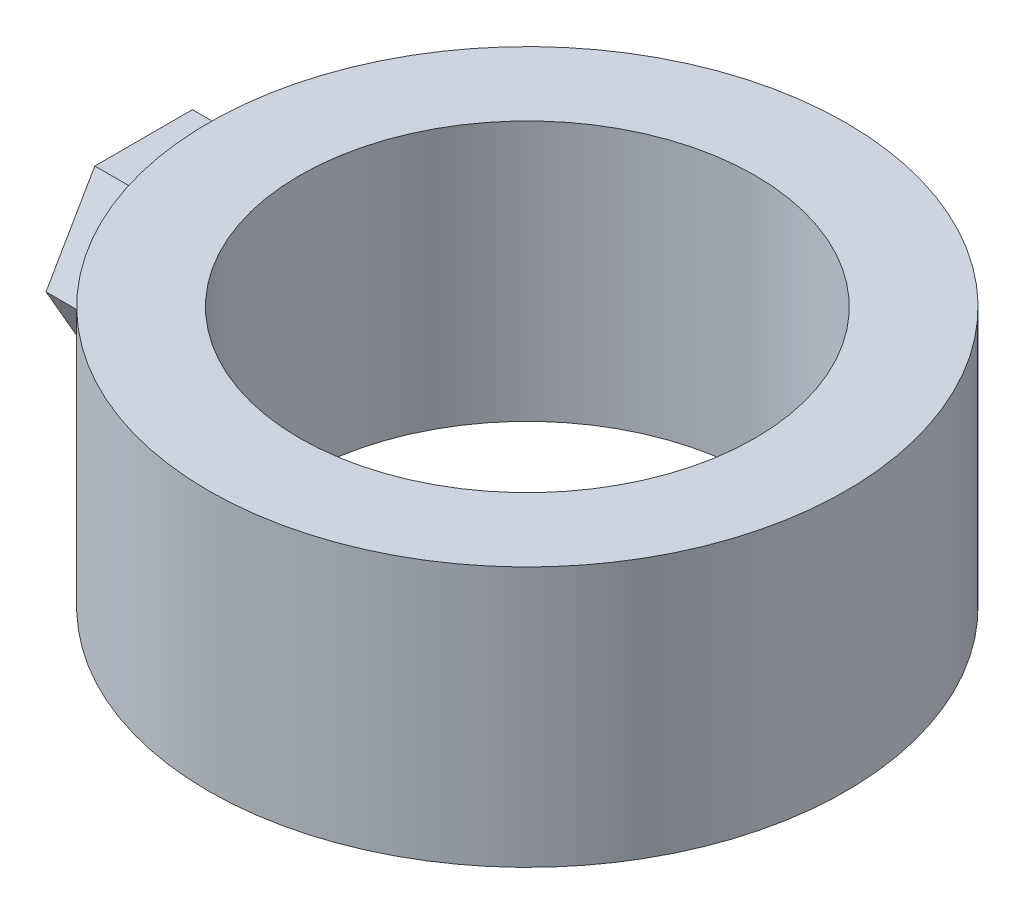
ISO-10303-21;
HEADER;
FILE_DESCRIPTION(('STEP AP214'),'2;1');
FILE_NAME('part.step','',(''),(''),'','','');
FILE_SCHEMA(('AUTOMOTIVE_DESIGN { 1 0 10303 214 1 1 1 1 }'));
ENDSEC;
DATA;
#1=APPLICATION_CONTEXT('core data for automotive mechanical design processes');
#2=APPLICATION_PROTOCOL_DEFINITION('international standard','automotive_design',2000,#1);
#3=PRODUCT_CONTEXT('',#1,'mechanical');
#4=PRODUCT('Part','Part','',(#3));
#5=PRODUCT_RELATED_PRODUCT_CATEGORY('part','',(#4));
#6=PRODUCT_DEFINITION_FORMATION('','',#4);
#7=PRODUCT_DEFINITION_CONTEXT('part definition',#1,'design');
#8=PRODUCT_DEFINITION('design','',#6,#7);
#9=PRODUCT_DEFINITION_SHAPE('','',#8);
#10=(LENGTH_UNIT() NAMED_UNIT(*) SI_UNIT(.MILLI.,.METRE.));
#11=(NAMED_UNIT(*) PLANE_ANGLE_UNIT() SI_UNIT($,.RADIAN.));
#12=(NAMED_UNIT(*) SI_UNIT($,.STERADIAN.) SOLID_ANGLE_UNIT());
#13=UNCERTAINTY_MEASURE_WITH_UNIT(LENGTH_MEASURE(1.E-05),#10,'distance_accuracy_value','');
#14=(GEOMETRIC_REPRESENTATION_CONTEXT(3) GLOBAL_UNCERTAINTY_ASSIGNED_CONTEXT((#13)) GLOBAL_UNIT_ASSIGNED_CONTEXT((#10,
#11,#12)) REPRESENTATION_CONTEXT('',''));
#15=CARTESIAN_POINT('',(0.,0.,0.));
#16=DIRECTION('',(0.,0.,1.));
#17=DIRECTION('',(1.,0.,0.));
#18=AXIS2_PLACEMENT_3D('',#15,#16,#17);
#19=CARTESIAN_POINT('',(0.,10.,0.));
#20=DIRECTION('',(0.,1.,0.));
#21=DIRECTION('',(0.,0.,1.));
#22=AXIS2_PLACEMENT_3D('',#19,#20,#21);
#23=PLANE('',#22);
#24=CARTESIAN_POINT('',(0.,10.,0.));
#25=DIRECTION('',(0.,1.,0.));
#26=DIRECTION('',(0.,0.,1.));
#27=AXIS2_PLACEMENT_3D('',#24,#25,#26);
#28=CIRCLE('',#27,24.5);
#29=CARTESIAN_POINT('',(0.,10.,24.5));
#30=VERTEX_POINT('',#29);
#31=EDGE_CURVE('E151',#30,#30,#28,.T.);
#32=ORIENTED_EDGE('',*,*,#31,.T.);
#33=EDGE_LOOP('',(#32));
#34=FACE_BOUND('',#33,.T.);
#35=CARTESIAN_POINT('',(0.,10.,0.));
#36=DIRECTION('',(0.,1.,0.));
#37=DIRECTION('',(0.,0.,1.));
#38=AXIS2_PLACEMENT_3D('',#35,#36,#37);
#39=CIRCLE('',#38,17.5);
#40=CARTESIAN_POINT('',(0.,10.,17.5));
#41=VERTEX_POINT('',#40);
#42=EDGE_CURVE('E145',#41,#41,#39,.T.);
#43=ORIENTED_EDGE('',*,*,#42,.F.);
#44=EDGE_LOOP('',(#43));
#45=FACE_BOUND('',#44,.T.);
#46=ADVANCED_FACE('F47',(#34,#45),#23,.T.);
#47=CARTESIAN_POINT('',(0.,-10.,0.));
#48=DIRECTION('',(0.,1.,0.));
#49=DIRECTION('',(0.,0.,1.));
#50=AXIS2_PLACEMENT_3D('',#47,#48,#49);
#51=PLANE('',#50);
#52=CARTESIAN_POINT('',(0.,-10.,0.));
#53=DIRECTION('',(0.,1.,0.));
#54=DIRECTION('',(0.,0.,1.));
#55=AXIS2_PLACEMENT_3D('',#52,#53,#54);
#56=CIRCLE('',#55,24.5);
#57=CARTESIAN_POINT('',(0.,-10.,24.5));
#58=VERTEX_POINT('',#57);
#59=EDGE_CURVE('E148',#58,#58,#56,.T.);
#60=ORIENTED_EDGE('',*,*,#59,.F.);
#61=EDGE_LOOP('',(#60));
#62=FACE_BOUND('',#61,.T.);
#63=CARTESIAN_POINT('',(0.,-10.,0.));
#64=DIRECTION('',(0.,1.,0.));
#65=DIRECTION('',(0.,0.,1.));
#66=AXIS2_PLACEMENT_3D('',#63,#64,#65);
#67=CIRCLE('',#66,17.5);
#68=CARTESIAN_POINT('',(0.,-10.,17.5));
#69=VERTEX_POINT('',#68);
#70=EDGE_CURVE('E134',#69,#69,#67,.T.);
#71=ORIENTED_EDGE('',*,*,#70,.T.);
#72=EDGE_LOOP('',(#71));
#73=FACE_BOUND('',#72,.T.);
#74=ADVANCED_FACE('F186',(#62,#73),#51,.F.);
#75=CARTESIAN_POINT('',(0.,10.,0.));
#76=DIRECTION('',(0.,-1.,0.));
#77=DIRECTION('',(0.,0.,-1.));
#78=AXIS2_PLACEMENT_3D('',#75,#76,#77);
#79=CYLINDRICAL_SURFACE('',#78,24.5);
#80=CARTESIAN_POINT('',(0.,-6.5,0.));
#81=DIRECTION('',(0.,-1.,0.));
#82=DIRECTION('',(0.,0.,-1.));
#83=AXIS2_PLACEMENT_3D('',#80,#81,#82);
#84=CIRCLE('',#83,24.5);
#85=CARTESIAN_POINT('',(-24.2108790973535,-6.5,3.75277674973257));
#86=VERTEX_POINT('',#85);
#87=CARTESIAN_POINT('',(-24.2108790973535,-6.5,-3.75277674973257));
#88=VERTEX_POINT('',#87);
#89=EDGE_CURVE('E55',#86,#88,#84,.T.);
#90=ORIENTED_EDGE('',*,*,#89,.T.);
#91=CARTESIAN_POINT('',(0.,-13.,0.));
#92=DIRECTION('',(0.,-0.5,-0.866025403784439));
#93=DIRECTION('',(0.,-0.866025403784439,0.5));
#94=AXIS2_PLACEMENT_3D('',#91,#92,#93);
#95=ELLIPSE('',#94,49.,24.5);
#96=CARTESIAN_POINT('',(-23.3220210673661,0.,-7.50555349946513));
#97=VERTEX_POINT('',#96);
#98=EDGE_CURVE('E13',#88,#97,#95,.T.);
#99=ORIENTED_EDGE('',*,*,#98,.T.);
#100=CARTESIAN_POINT('',(0.,13.,0.));
#101=DIRECTION('',(0.,0.5,-0.866025403784438));
#102=DIRECTION('',(0.,-0.866025403784439,-0.5));
#103=AXIS2_PLACEMENT_3D('',#100,#101,#102);
#104=ELLIPSE('',#103,49.,24.5);
#105=CARTESIAN_POINT('',(-24.2108790973535,6.5,-3.75277674973257));
#106=VERTEX_POINT('',#105);
#107=EDGE_CURVE('E101',#97,#106,#104,.T.);
#108=ORIENTED_EDGE('',*,*,#107,.T.);
#109=CARTESIAN_POINT('',(0.,6.5,0.));
#110=DIRECTION('',(0.,1.,0.));
#111=DIRECTION('',(0.,0.,1.));
#112=AXIS2_PLACEMENT_3D('',#109,#110,#111);
#113=CIRCLE('',#112,24.5);
#114=CARTESIAN_POINT('',(-24.2108790973535,6.5,3.75277674973257));
#115=VERTEX_POINT('',#114);
#116=EDGE_CURVE('E157',#106,#115,#113,.T.);
#117=ORIENTED_EDGE('',*,*,#116,.T.);
#118=CARTESIAN_POINT('',(0.,13.,0.));
#119=DIRECTION('',(0.,0.5,0.866025403784439));
#120=DIRECTION('',(0.,-0.866025403784439,0.5));
#121=AXIS2_PLACEMENT_3D('',#118,#119,#120);
#122=ELLIPSE('',#121,49.,24.5);
#123=CARTESIAN_POINT('',(-23.3220210673661,0.,7.50555349946513));
#124=VERTEX_POINT('',#123);
#125=EDGE_CURVE('E160',#115,#124,#122,.T.);
#126=ORIENTED_EDGE('',*,*,#125,.T.);
#127=CARTESIAN_POINT('',(0.,-13.,0.));
#128=DIRECTION('',(0.,-0.5,0.866025403784439));
#129=DIRECTION('',(0.,-0.866025403784439,-0.5));
#130=AXIS2_PLACEMENT_3D('',#127,#128,#129);
#131=ELLIPSE('',#130,49.,24.5);
#132=EDGE_CURVE('E163',#124,#86,#131,.T.);
#133=ORIENTED_EDGE('',*,*,#132,.T.);
#134=EDGE_LOOP('',(#90,#99,#108,#117,#126,#133));
#135=FACE_BOUND('',#134,.T.);
#136=ORIENTED_EDGE('',*,*,#31,.F.);
#137=EDGE_LOOP('',(#136));
#138=FACE_BOUND('',#137,.T.);
#139=ORIENTED_EDGE('',*,*,#59,.T.);
#140=EDGE_LOOP('',(#139));
#141=FACE_BOUND('',#140,.T.);
#142=ADVANCED_FACE('F49',(#135,#138,#141),#79,.T.);
#143=CARTESIAN_POINT('',(0.,10.,0.));
#144=DIRECTION('',(0.,-1.,0.));
#145=DIRECTION('',(0.,0.,-1.));
#146=AXIS2_PLACEMENT_3D('',#143,#144,#145);
#147=CYLINDRICAL_SURFACE('',#146,17.5);
#148=ORIENTED_EDGE('',*,*,#42,.T.);
#149=EDGE_LOOP('',(#148));
#150=FACE_BOUND('',#149,.T.);
#151=ORIENTED_EDGE('',*,*,#70,.F.);
#152=EDGE_LOOP('',(#151));
#153=FACE_BOUND('',#152,.T.);
#154=ADVANCED_FACE('F195',(#150,#153),#147,.F.);
#155=CARTESIAN_POINT('',(-29.5,-6.5,-3.75277674973257));
#156=DIRECTION('',(0.,-0.5,-0.866025403784439));
#157=DIRECTION('',(0.,0.866025403784439,-0.5));
#158=AXIS2_PLACEMENT_3D('',#155,#156,#157);
#159=PLANE('',#158);
#160=ORIENTED_EDGE('',*,*,#98,.F.);
#161=DIRECTION('',(1.,0.,0.));
#162=VECTOR('',#161,1.);
#163=CARTESIAN_POINT('',(-29.5,-6.5,-3.75277674973257));
#164=LINE('',#163,#162);
#165=CARTESIAN_POINT('',(-29.5,-6.5,-3.75277674973257));
#166=VERTEX_POINT('',#165);
#167=EDGE_CURVE('E117',#166,#88,#164,.T.);
#168=ORIENTED_EDGE('',*,*,#167,.F.);
#169=DIRECTION('',(0.,0.866025403784439,-0.5));
#170=VECTOR('',#169,1.);
#171=CARTESIAN_POINT('',(-29.5,-6.5,-3.75277674973257));
#172=LINE('',#171,#170);
#173=CARTESIAN_POINT('',(-29.5,0.,-7.50555349946513));
#174=VERTEX_POINT('',#173);
#175=EDGE_CURVE('E110',#166,#174,#172,.T.);
#176=ORIENTED_EDGE('',*,*,#175,.T.);
#177=DIRECTION('',(1.,0.,0.));
#178=VECTOR('',#177,1.);
#179=CARTESIAN_POINT('',(-29.5,0.,-7.50555349946513));
#180=LINE('',#179,#178);
#181=EDGE_CURVE('E96',#174,#97,#180,.T.);
#182=ORIENTED_EDGE('',*,*,#181,.T.);
#183=EDGE_LOOP('',(#160,#168,#176,#182));
#184=FACE_BOUND('',#183,.T.);
#185=ADVANCED_FACE('F116',(#184),#159,.T.);
#186=CARTESIAN_POINT('',(-29.5,-6.5,3.75277674973257));
#187=DIRECTION('',(0.,-1.,0.));
#188=DIRECTION('',(0.,0.,-1.));
#189=AXIS2_PLACEMENT_3D('',#186,#187,#188);
#190=PLANE('',#189);
#191=ORIENTED_EDGE('',*,*,#89,.F.);
#192=DIRECTION('',(1.,0.,0.));
#193=VECTOR('',#192,1.);
#194=CARTESIAN_POINT('',(-29.5,-6.5,3.75277674973257));
#195=LINE('',#194,#193);
#196=CARTESIAN_POINT('',(-29.5,-6.5,3.75277674973257));
#197=VERTEX_POINT('',#196);
#198=EDGE_CURVE('E135',#197,#86,#195,.T.);
#199=ORIENTED_EDGE('',*,*,#198,.F.);
#200=DIRECTION('',(0.,0.,-1.));
#201=VECTOR('',#200,1.);
#202=CARTESIAN_POINT('',(-29.5,-6.5,3.75277674973257));
#203=LINE('',#202,#201);
#204=EDGE_CURVE('E103',#197,#166,#203,.T.);
#205=ORIENTED_EDGE('',*,*,#204,.T.);
#206=ORIENTED_EDGE('',*,*,#167,.T.);
#207=EDGE_LOOP('',(#191,#199,#205,#206));
#208=FACE_BOUND('',#207,.T.);
#209=ADVANCED_FACE('F169',(#208),#190,.T.);
#210=CARTESIAN_POINT('',(-29.5,0.,7.50555349946513));
#211=DIRECTION('',(0.,-0.5,0.866025403784439));
#212=DIRECTION('',(0.,-0.866025403784439,-0.5));
#213=AXIS2_PLACEMENT_3D('',#210,#211,#212);
#214=PLANE('',#213);
#215=ORIENTED_EDGE('',*,*,#132,.F.);
#216=DIRECTION('',(1.,0.,0.));
#217=VECTOR('',#216,1.);
#218=CARTESIAN_POINT('',(-29.5,0.,7.50555349946513));
#219=LINE('',#218,#217);
#220=CARTESIAN_POINT('',(-29.5,0.,7.50555349946513));
#221=VERTEX_POINT('',#220);
#222=EDGE_CURVE('E138',#221,#124,#219,.T.);
#223=ORIENTED_EDGE('',*,*,#222,.F.);
#224=DIRECTION('',(0.,-0.866025403784439,-0.5));
#225=VECTOR('',#224,1.);
#226=CARTESIAN_POINT('',(-29.5,0.,7.50555349946513));
#227=LINE('',#226,#225);
#228=EDGE_CURVE('E129',#221,#197,#227,.T.);
#229=ORIENTED_EDGE('',*,*,#228,.T.);
#230=ORIENTED_EDGE('',*,*,#198,.T.);
#231=EDGE_LOOP('',(#215,#223,#229,#230));
#232=FACE_BOUND('',#231,.T.);
#233=ADVANCED_FACE('F171',(#232),#214,.T.);
#234=CARTESIAN_POINT('',(-29.5,6.5,3.75277674973257));
#235=DIRECTION('',(0.,0.5,0.866025403784439));
#236=DIRECTION('',(0.,-0.866025403784439,0.5));
#237=AXIS2_PLACEMENT_3D('',#234,#235,#236);
#238=PLANE('',#237);
#239=ORIENTED_EDGE('',*,*,#125,.F.);
#240=DIRECTION('',(1.,0.,0.));
#241=VECTOR('',#240,1.);
#242=CARTESIAN_POINT('',(-29.5,6.5,3.75277674973257));
#243=LINE('',#242,#241);
#244=CARTESIAN_POINT('',(-29.5,6.5,3.75277674973257));
#245=VERTEX_POINT('',#244);
#246=EDGE_CURVE('E141',#245,#115,#243,.T.);
#247=ORIENTED_EDGE('',*,*,#246,.F.);
#248=DIRECTION('',(0.,-0.866025403784439,0.5));
#249=VECTOR('',#248,1.);
#250=CARTESIAN_POINT('',(-29.5,6.5,3.75277674973257));
#251=LINE('',#250,#249);
#252=EDGE_CURVE('E126',#245,#221,#251,.T.);
#253=ORIENTED_EDGE('',*,*,#252,.T.);
#254=ORIENTED_EDGE('',*,*,#222,.T.);
#255=EDGE_LOOP('',(#239,#247,#253,#254));
#256=FACE_BOUND('',#255,.T.);
#257=ADVANCED_FACE('F174',(#256),#238,.T.);
#258=CARTESIAN_POINT('',(-29.5,6.5,-3.75277674973257));
#259=DIRECTION('',(0.,1.,0.));
#260=DIRECTION('',(0.,0.,1.));
#261=AXIS2_PLACEMENT_3D('',#258,#259,#260);
#262=PLANE('',#261);
#263=ORIENTED_EDGE('',*,*,#116,.F.);
#264=DIRECTION('',(1.,0.,0.));
#265=VECTOR('',#264,1.);
#266=CARTESIAN_POINT('',(-29.5,6.5,-3.75277674973257));
#267=LINE('',#266,#265);
#268=CARTESIAN_POINT('',(-29.5,6.5,-3.75277674973257));
#269=VERTEX_POINT('',#268);
#270=EDGE_CURVE('E62',#269,#106,#267,.T.);
#271=ORIENTED_EDGE('',*,*,#270,.F.);
#272=DIRECTION('',(0.,0.,1.));
#273=VECTOR('',#272,1.);
#274=CARTESIAN_POINT('',(-29.5,6.5,-3.75277674973257));
#275=LINE('',#274,#273);
#276=EDGE_CURVE('E114',#269,#245,#275,.T.);
#277=ORIENTED_EDGE('',*,*,#276,.T.);
#278=ORIENTED_EDGE('',*,*,#246,.T.);
#279=EDGE_LOOP('',(#263,#271,#277,#278));
#280=FACE_BOUND('',#279,.T.);
#281=ADVANCED_FACE('F176',(#280),#262,.T.);
#282=CARTESIAN_POINT('',(-29.5,0.,-7.50555349946513));
#283=DIRECTION('',(0.,0.5,-0.866025403784438));
#284=DIRECTION('',(0.,0.866025403784439,0.5));
#285=AXIS2_PLACEMENT_3D('',#282,#283,#284);
#286=PLANE('',#285);
#287=ORIENTED_EDGE('',*,*,#107,.F.);
#288=ORIENTED_EDGE('',*,*,#181,.F.);
#289=DIRECTION('',(0.,0.866025403784438,0.5));
#290=VECTOR('',#289,1.);
#291=CARTESIAN_POINT('',(-29.5,0.,-7.50555349946513));
#292=LINE('',#291,#290);
#293=EDGE_CURVE('E99',#174,#269,#292,.T.);
#294=ORIENTED_EDGE('',*,*,#293,.T.);
#295=ORIENTED_EDGE('',*,*,#270,.T.);
#296=EDGE_LOOP('',(#287,#288,#294,#295));
#297=FACE_BOUND('',#296,.T.);
#298=ADVANCED_FACE('F98',(#297),#286,.T.);
#299=CARTESIAN_POINT('',(-29.5,0.,0.));
#300=DIRECTION('',(1.,0.,0.));
#301=DIRECTION('',(0.,0.,-1.));
#302=AXIS2_PLACEMENT_3D('',#299,#300,#301);
#303=PLANE('',#302);
#304=CARTESIAN_POINT('',(-29.5,0.,0.));
#305=DIRECTION('',(-1.,0.,0.));
#306=DIRECTION('',(0.,0.,1.));
#307=AXIS2_PLACEMENT_3D('',#304,#305,#306);
#308=CIRCLE('',#307,4.);
#309=CARTESIAN_POINT('',(-29.5,0.,4.));
#310=VERTEX_POINT('',#309);
#311=EDGE_CURVE('E121',#310,#310,#308,.T.);
#312=ORIENTED_EDGE('',*,*,#311,.F.);
#313=EDGE_LOOP('',(#312));
#314=FACE_BOUND('',#313,.T.);
#315=ORIENTED_EDGE('',*,*,#175,.F.);
#316=ORIENTED_EDGE('',*,*,#204,.F.);
#317=ORIENTED_EDGE('',*,*,#228,.F.);
#318=ORIENTED_EDGE('',*,*,#252,.F.);
#319=ORIENTED_EDGE('',*,*,#276,.F.);
#320=ORIENTED_EDGE('',*,*,#293,.F.);
#321=EDGE_LOOP('',(#315,#316,#317,#318,#319,#320));
#322=FACE_BOUND('',#321,.T.);
#323=ADVANCED_FACE('F108',(#314,#322),#303,.F.);
#324=CARTESIAN_POINT('',(-24.5,0.,0.));
#325=DIRECTION('',(-1.,0.,0.));
#326=DIRECTION('',(0.,0.,1.));
#327=AXIS2_PLACEMENT_3D('',#324,#325,#326);
#328=CYLINDRICAL_SURFACE('',#327,4.);
#329=CARTESIAN_POINT('',(-24.5,0.,0.));
#330=DIRECTION('',(-1.,0.,0.));
#331=DIRECTION('',(0.,0.,1.));
#332=AXIS2_PLACEMENT_3D('',#329,#330,#331);
#333=CIRCLE('',#332,4.);
#334=CARTESIAN_POINT('',(-24.5,0.,4.));
#335=VERTEX_POINT('',#334);
#336=EDGE_CURVE('E118',#335,#335,#333,.T.);
#337=ORIENTED_EDGE('',*,*,#336,.F.);
#338=EDGE_LOOP('',(#337));
#339=FACE_BOUND('',#338,.T.);
#340=ORIENTED_EDGE('',*,*,#311,.T.);
#341=EDGE_LOOP('',(#340));
#342=FACE_BOUND('',#341,.T.);
#343=ADVANCED_FACE('F211',(#339,#342),#328,.F.);
#344=CARTESIAN_POINT('',(-24.5,0.,0.));
#345=DIRECTION('',(-1.,0.,0.));
#346=DIRECTION('',(0.,0.,1.));
#347=AXIS2_PLACEMENT_3D('',#344,#345,#346);
#348=PLANE('',#347);
#349=ORIENTED_EDGE('',*,*,#336,.T.);
#350=EDGE_LOOP('',(#349));
#351=FACE_BOUND('',#350,.T.);
#352=ADVANCED_FACE('F215',(#351),#348,.T.);
#353=CLOSED_SHELL('',(#46,#74,#142,#154,#185,#209,#233,#257,#281,#298,#323,#343,#352));
#354=MANIFOLD_SOLID_BREP('B2',#353);
#355=ADVANCED_BREP_SHAPE_REPRESENTATION('',(#18,#354),#14);
#356=SHAPE_DEFINITION_REPRESENTATION(#9,#355);
ENDSEC;
END-ISO-10303-21;
